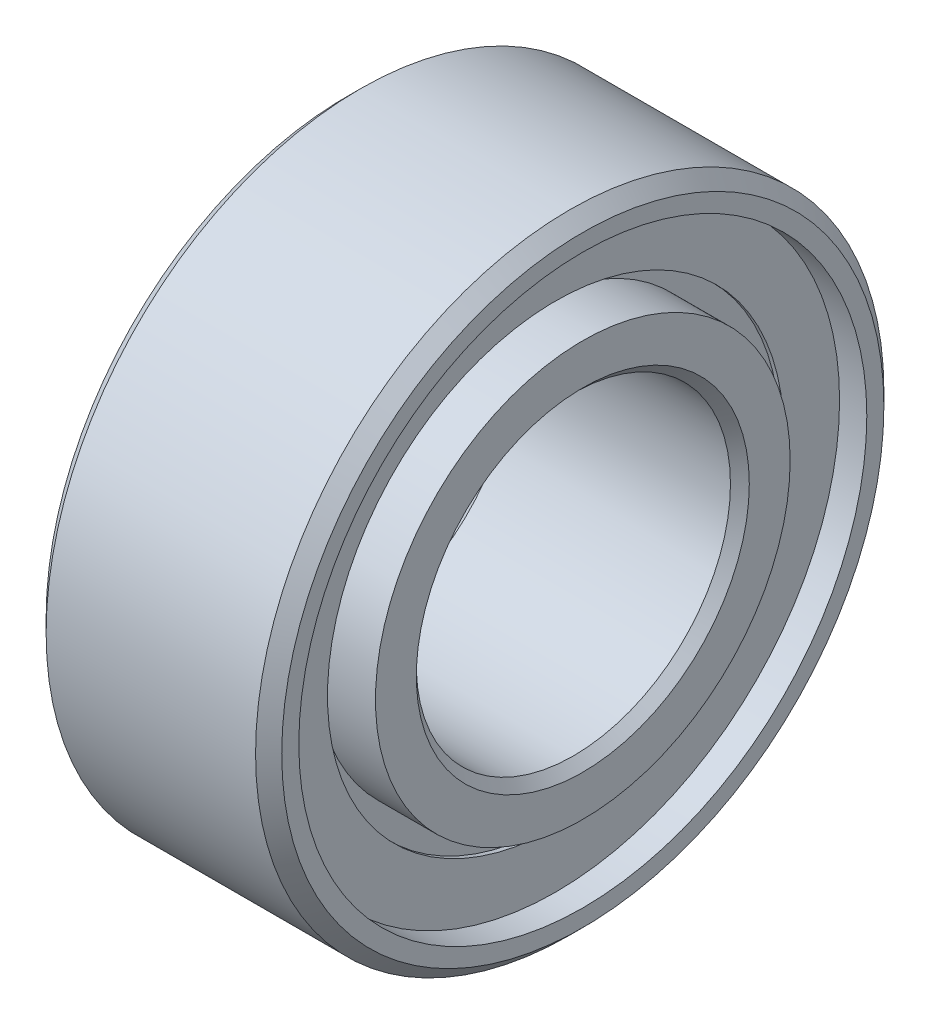
ISO-10303-21;
HEADER;
FILE_DESCRIPTION(('STEP AP214'),'2;1');
FILE_NAME('part.step','',(''),(''),'','','');
FILE_SCHEMA(('AUTOMOTIVE_DESIGN { 1 0 10303 214 1 1 1 1 }'));
ENDSEC;
DATA;
#1=APPLICATION_CONTEXT('core data for automotive mechanical design processes');
#2=APPLICATION_PROTOCOL_DEFINITION('international standard','automotive_design',2000,#1);
#3=PRODUCT_CONTEXT('',#1,'mechanical');
#4=PRODUCT('Part','Part','',(#3));
#5=PRODUCT_RELATED_PRODUCT_CATEGORY('part','',(#4));
#6=PRODUCT_DEFINITION_FORMATION('','',#4);
#7=PRODUCT_DEFINITION_CONTEXT('part definition',#1,'design');
#8=PRODUCT_DEFINITION('design','',#6,#7);
#9=PRODUCT_DEFINITION_SHAPE('','',#8);
#10=(LENGTH_UNIT() NAMED_UNIT(*) SI_UNIT(.MILLI.,.METRE.));
#11=(NAMED_UNIT(*) PLANE_ANGLE_UNIT() SI_UNIT($,.RADIAN.));
#12=(NAMED_UNIT(*) SI_UNIT($,.STERADIAN.) SOLID_ANGLE_UNIT());
#13=UNCERTAINTY_MEASURE_WITH_UNIT(LENGTH_MEASURE(1.E-05),#10,'distance_accuracy_value','');
#14=(GEOMETRIC_REPRESENTATION_CONTEXT(3) GLOBAL_UNCERTAINTY_ASSIGNED_CONTEXT((#13)) GLOBAL_UNIT_ASSIGNED_CONTEXT((#10,
#11,#12)) REPRESENTATION_CONTEXT('',''));
#15=CARTESIAN_POINT('',(0.,0.,0.));
#16=DIRECTION('',(0.,0.,1.));
#17=DIRECTION('',(1.,0.,0.));
#18=AXIS2_PLACEMENT_3D('',#15,#16,#17);
#19=CARTESIAN_POINT('',(-2.619375,0.,0.));
#20=DIRECTION('',(1.,0.,0.));
#21=DIRECTION('',(0.,0.,-1.));
#22=AXIS2_PLACEMENT_3D('',#19,#20,#21);
#23=CYLINDRICAL_SURFACE('',#22,3.175);
#24=CARTESIAN_POINT('',(2.19074999995428,0.,0.));
#25=DIRECTION('',(1.,0.,0.));
#26=DIRECTION('',(0.,-1.,0.));
#27=AXIS2_PLACEMENT_3D('',#24,#25,#26);
#28=CIRCLE('',#27,3.17499999999882);
#29=CARTESIAN_POINT('',(2.19074999995428,-3.17499999999882,0.));
#30=VERTEX_POINT('',#29);
#31=EDGE_CURVE('E32',#30,#30,#28,.T.);
#32=ORIENTED_EDGE('',*,*,#31,.T.);
#33=EDGE_LOOP('',(#32));
#34=FACE_BOUND('',#33,.T.);
#35=CARTESIAN_POINT('',(-2.19074999995428,0.,0.));
#36=DIRECTION('',(-1.,0.,0.));
#37=DIRECTION('',(0.,1.,0.));
#38=AXIS2_PLACEMENT_3D('',#35,#36,#37);
#39=CIRCLE('',#38,3.17499999999882);
#40=CARTESIAN_POINT('',(-2.19074999995428,3.17499999999882,0.));
#41=VERTEX_POINT('',#40);
#42=EDGE_CURVE('E29',#41,#41,#39,.T.);
#43=ORIENTED_EDGE('',*,*,#42,.T.);
#44=EDGE_LOOP('',(#43));
#45=FACE_BOUND('',#44,.T.);
#46=ADVANCED_FACE('F14',(#34,#45),#23,.F.);
#47=CARTESIAN_POINT('',(2.38124999992806,0.,0.));
#48=DIRECTION('',(1.,0.,0.));
#49=DIRECTION('',(0.,0.,-1.));
#50=AXIS2_PLACEMENT_3D('',#47,#48,#49);
#51=CONICAL_SURFACE('',#50,3.36550000002944,0.785398163546644);
#52=CARTESIAN_POINT('',(2.38124999992806,0.,0.));
#53=DIRECTION('',(1.,0.,0.));
#54=DIRECTION('',(0.,0.,-1.));
#55=AXIS2_PLACEMENT_3D('',#52,#53,#54);
#56=CIRCLE('',#55,3.36550000002944);
#57=CARTESIAN_POINT('',(2.38124999992806,0.,-3.36550000002944));
#58=VERTEX_POINT('',#57);
#59=EDGE_CURVE('E17',#58,#58,#56,.F.);
#60=ORIENTED_EDGE('',*,*,#59,.F.);
#61=EDGE_LOOP('',(#60));
#62=FACE_BOUND('',#61,.T.);
#63=ORIENTED_EDGE('',*,*,#31,.F.);
#64=EDGE_LOOP('',(#63));
#65=FACE_BOUND('',#64,.T.);
#66=ADVANCED_FACE('F97',(#62,#65),#51,.F.);
#67=CARTESIAN_POINT('',(-2.38124999992806,0.,0.));
#68=DIRECTION('',(-1.,0.,0.));
#69=DIRECTION('',(0.,0.,1.));
#70=AXIS2_PLACEMENT_3D('',#67,#68,#69);
#71=CONICAL_SURFACE('',#70,3.36550000002944,0.785398163546644);
#72=ORIENTED_EDGE('',*,*,#42,.F.);
#73=EDGE_LOOP('',(#72));
#74=FACE_BOUND('',#73,.T.);
#75=CARTESIAN_POINT('',(-2.38124999992806,0.,0.));
#76=DIRECTION('',(-1.,0.,0.));
#77=DIRECTION('',(0.,0.,1.));
#78=AXIS2_PLACEMENT_3D('',#75,#76,#77);
#79=CIRCLE('',#78,3.36550000002944);
#80=CARTESIAN_POINT('',(-2.38124999992806,0.,3.36550000002944));
#81=VERTEX_POINT('',#80);
#82=EDGE_CURVE('E87',#81,#81,#79,.T.);
#83=ORIENTED_EDGE('',*,*,#82,.T.);
#84=EDGE_LOOP('',(#83));
#85=FACE_BOUND('',#84,.T.);
#86=ADVANCED_FACE('F100',(#74,#85),#71,.F.);
#87=CARTESIAN_POINT('',(2.38125,0.,0.));
#88=DIRECTION('',(1.,0.,0.));
#89=DIRECTION('',(0.,0.,-1.));
#90=AXIS2_PLACEMENT_3D('',#87,#88,#89);
#91=PLANE('',#90);
#92=ORIENTED_EDGE('',*,*,#59,.T.);
#93=EDGE_LOOP('',(#92));
#94=FACE_BOUND('',#93,.T.);
#95=CARTESIAN_POINT('',(2.38125,0.,0.));
#96=DIRECTION('',(1.,0.,0.));
#97=DIRECTION('',(0.,0.,-1.));
#98=AXIS2_PLACEMENT_3D('',#95,#96,#97);
#99=CIRCLE('',#98,4.191);
#100=CARTESIAN_POINT('',(2.38125,0.,-4.191));
#101=VERTEX_POINT('',#100);
#102=EDGE_CURVE('E85',#101,#101,#99,.F.);
#103=ORIENTED_EDGE('',*,*,#102,.F.);
#104=EDGE_LOOP('',(#103));
#105=FACE_BOUND('',#104,.T.);
#106=ADVANCED_FACE('F94',(#94,#105),#91,.T.);
#107=CARTESIAN_POINT('',(-2.38125,0.,0.));
#108=DIRECTION('',(1.,0.,0.));
#109=DIRECTION('',(0.,0.,-1.));
#110=AXIS2_PLACEMENT_3D('',#107,#108,#109);
#111=PLANE('',#110);
#112=ORIENTED_EDGE('',*,*,#82,.F.);
#113=EDGE_LOOP('',(#112));
#114=FACE_BOUND('',#113,.T.);
#115=CARTESIAN_POINT('',(-2.38125,0.,0.));
#116=DIRECTION('',(1.,0.,0.));
#117=DIRECTION('',(0.,0.,-1.));
#118=AXIS2_PLACEMENT_3D('',#115,#116,#117);
#119=CIRCLE('',#118,4.191);
#120=CARTESIAN_POINT('',(-2.38125,0.,-4.191));
#121=VERTEX_POINT('',#120);
#122=EDGE_CURVE('E82',#121,#121,#119,.T.);
#123=ORIENTED_EDGE('',*,*,#122,.F.);
#124=EDGE_LOOP('',(#123));
#125=FACE_BOUND('',#124,.T.);
#126=ADVANCED_FACE('F113',(#114,#125),#111,.F.);
#127=CARTESIAN_POINT('',(-2.619375,0.,0.));
#128=DIRECTION('',(1.,0.,0.));
#129=DIRECTION('',(0.,0.,-1.));
#130=AXIS2_PLACEMENT_3D('',#127,#128,#129);
#131=CYLINDRICAL_SURFACE('',#130,4.191);
#132=CARTESIAN_POINT('',(1.190625,0.,0.));
#133=DIRECTION('',(1.,0.,0.));
#134=DIRECTION('',(0.,0.,-1.));
#135=AXIS2_PLACEMENT_3D('',#132,#133,#134);
#136=CIRCLE('',#135,4.191);
#137=CARTESIAN_POINT('',(1.190625,0.,-4.191));
#138=VERTEX_POINT('',#137);
#139=EDGE_CURVE('E79',#138,#138,#136,.F.);
#140=ORIENTED_EDGE('',*,*,#139,.F.);
#141=EDGE_LOOP('',(#140));
#142=FACE_BOUND('',#141,.T.);
#143=ORIENTED_EDGE('',*,*,#102,.T.);
#144=EDGE_LOOP('',(#143));
#145=FACE_BOUND('',#144,.T.);
#146=ADVANCED_FACE('F189',(#142,#145),#131,.T.);
#147=CARTESIAN_POINT('',(-2.619375,0.,0.));
#148=DIRECTION('',(1.,0.,0.));
#149=DIRECTION('',(0.,0.,-1.));
#150=AXIS2_PLACEMENT_3D('',#147,#148,#149);
#151=CYLINDRICAL_SURFACE('',#150,4.191);
#152=ORIENTED_EDGE('',*,*,#122,.T.);
#153=EDGE_LOOP('',(#152));
#154=FACE_BOUND('',#153,.T.);
#155=CARTESIAN_POINT('',(-1.190625,0.,0.));
#156=DIRECTION('',(1.,0.,0.));
#157=DIRECTION('',(0.,0.,-1.));
#158=AXIS2_PLACEMENT_3D('',#155,#156,#157);
#159=CIRCLE('',#158,4.191);
#160=CARTESIAN_POINT('',(-1.190625,0.,-4.191));
#161=VERTEX_POINT('',#160);
#162=EDGE_CURVE('E76',#161,#161,#159,.F.);
#163=ORIENTED_EDGE('',*,*,#162,.T.);
#164=EDGE_LOOP('',(#163));
#165=FACE_BOUND('',#164,.T.);
#166=ADVANCED_FACE('F185',(#154,#165),#151,.T.);
#167=CARTESIAN_POINT('',(1.190625,0.,0.));
#168=DIRECTION('',(1.,0.,0.));
#169=DIRECTION('',(0.,0.,-1.));
#170=AXIS2_PLACEMENT_3D('',#167,#168,#169);
#171=PLANE('',#170);
#172=ORIENTED_EDGE('',*,*,#139,.T.);
#173=EDGE_LOOP('',(#172));
#174=FACE_BOUND('',#173,.T.);
#175=CARTESIAN_POINT('',(1.190625,0.,0.));
#176=DIRECTION('',(1.,0.,0.));
#177=DIRECTION('',(0.,0.,-1.));
#178=AXIS2_PLACEMENT_3D('',#175,#176,#177);
#179=CIRCLE('',#178,5.7404);
#180=CARTESIAN_POINT('',(1.190625,0.,-5.7404));
#181=VERTEX_POINT('',#180);
#182=EDGE_CURVE('E73',#181,#181,#179,.T.);
#183=ORIENTED_EDGE('',*,*,#182,.T.);
#184=EDGE_LOOP('',(#183));
#185=FACE_BOUND('',#184,.T.);
#186=ADVANCED_FACE('F181',(#174,#185),#171,.T.);
#187=CARTESIAN_POINT('',(-1.190625,0.,0.));
#188=DIRECTION('',(1.,0.,0.));
#189=DIRECTION('',(0.,0.,-1.));
#190=AXIS2_PLACEMENT_3D('',#187,#188,#189);
#191=PLANE('',#190);
#192=ORIENTED_EDGE('',*,*,#162,.F.);
#193=EDGE_LOOP('',(#192));
#194=FACE_BOUND('',#193,.T.);
#195=CARTESIAN_POINT('',(-1.190625,0.,0.));
#196=DIRECTION('',(1.,0.,0.));
#197=DIRECTION('',(0.,0.,-1.));
#198=AXIS2_PLACEMENT_3D('',#195,#196,#197);
#199=CIRCLE('',#198,5.7404);
#200=CARTESIAN_POINT('',(-1.190625,0.,-5.7404));
#201=VERTEX_POINT('',#200);
#202=EDGE_CURVE('E70',#201,#201,#199,.F.);
#203=ORIENTED_EDGE('',*,*,#202,.T.);
#204=EDGE_LOOP('',(#203));
#205=FACE_BOUND('',#204,.T.);
#206=ADVANCED_FACE('F177',(#194,#205),#191,.F.);
#207=CARTESIAN_POINT('',(-2.619375,0.,0.));
#208=DIRECTION('',(1.,0.,0.));
#209=DIRECTION('',(0.,0.,-1.));
#210=AXIS2_PLACEMENT_3D('',#207,#208,#209);
#211=CYLINDRICAL_SURFACE('',#210,5.7404);
#212=ORIENTED_EDGE('',*,*,#182,.F.);
#213=EDGE_LOOP('',(#212));
#214=FACE_BOUND('',#213,.T.);
#215=CARTESIAN_POINT('',(1.7412890625,0.,0.));
#216=DIRECTION('',(1.,0.,0.));
#217=DIRECTION('',(0.,0.,-1.));
#218=AXIS2_PLACEMENT_3D('',#215,#216,#217);
#219=CIRCLE('',#218,5.7404);
#220=CARTESIAN_POINT('',(1.7412890625,0.,-5.7404));
#221=VERTEX_POINT('',#220);
#222=EDGE_CURVE('E67',#221,#221,#219,.T.);
#223=ORIENTED_EDGE('',*,*,#222,.T.);
#224=EDGE_LOOP('',(#223));
#225=FACE_BOUND('',#224,.T.);
#226=ADVANCED_FACE('F173',(#214,#225),#211,.F.);
#227=CARTESIAN_POINT('',(-2.619375,0.,0.));
#228=DIRECTION('',(1.,0.,0.));
#229=DIRECTION('',(0.,0.,-1.));
#230=AXIS2_PLACEMENT_3D('',#227,#228,#229);
#231=CYLINDRICAL_SURFACE('',#230,5.7404);
#232=ORIENTED_EDGE('',*,*,#202,.F.);
#233=EDGE_LOOP('',(#232));
#234=FACE_BOUND('',#233,.T.);
#235=CARTESIAN_POINT('',(-1.7412890625,0.,0.));
#236=DIRECTION('',(1.,0.,0.));
#237=DIRECTION('',(0.,0.,-1.));
#238=AXIS2_PLACEMENT_3D('',#235,#236,#237);
#239=CIRCLE('',#238,5.7404);
#240=CARTESIAN_POINT('',(-1.7412890625,0.,-5.7404));
#241=VERTEX_POINT('',#240);
#242=EDGE_CURVE('E64',#241,#241,#239,.T.);
#243=ORIENTED_EDGE('',*,*,#242,.F.);
#244=EDGE_LOOP('',(#243));
#245=FACE_BOUND('',#244,.T.);
#246=ADVANCED_FACE('F169',(#234,#245),#231,.F.);
#247=CARTESIAN_POINT('',(1.7412890625,0.,0.));
#248=DIRECTION('',(1.,0.,0.));
#249=DIRECTION('',(0.,0.,-1.));
#250=AXIS2_PLACEMENT_3D('',#247,#248,#249);
#251=PLANE('',#250);
#252=CARTESIAN_POINT('',(1.7412890625,0.,0.));
#253=DIRECTION('',(1.,0.,0.));
#254=DIRECTION('',(0.,0.,-1.));
#255=AXIS2_PLACEMENT_3D('',#252,#253,#254);
#256=CIRCLE('',#255,4.6101);
#257=CARTESIAN_POINT('',(1.7412890625,0.,-4.6101));
#258=VERTEX_POINT('',#257);
#259=EDGE_CURVE('E61',#258,#258,#256,.T.);
#260=ORIENTED_EDGE('',*,*,#259,.T.);
#261=EDGE_LOOP('',(#260));
#262=FACE_BOUND('',#261,.T.);
#263=ORIENTED_EDGE('',*,*,#222,.F.);
#264=EDGE_LOOP('',(#263));
#265=FACE_BOUND('',#264,.T.);
#266=ADVANCED_FACE('F165',(#262,#265),#251,.F.);
#267=CARTESIAN_POINT('',(-1.7412890625,0.,0.));
#268=DIRECTION('',(1.,0.,0.));
#269=DIRECTION('',(0.,0.,-1.));
#270=AXIS2_PLACEMENT_3D('',#267,#268,#269);
#271=PLANE('',#270);
#272=CARTESIAN_POINT('',(-1.7412890625,0.,0.));
#273=DIRECTION('',(1.,0.,0.));
#274=DIRECTION('',(0.,0.,-1.));
#275=AXIS2_PLACEMENT_3D('',#272,#273,#274);
#276=CIRCLE('',#275,4.6101);
#277=CARTESIAN_POINT('',(-1.7412890625,0.,-4.6101));
#278=VERTEX_POINT('',#277);
#279=EDGE_CURVE('E58',#278,#278,#276,.F.);
#280=ORIENTED_EDGE('',*,*,#279,.T.);
#281=EDGE_LOOP('',(#280));
#282=FACE_BOUND('',#281,.T.);
#283=ORIENTED_EDGE('',*,*,#242,.T.);
#284=EDGE_LOOP('',(#283));
#285=FACE_BOUND('',#284,.T.);
#286=ADVANCED_FACE('F161',(#282,#285),#271,.T.);
#287=CARTESIAN_POINT('',(1.73682421875,0.,0.));
#288=DIRECTION('',(1.,0.,0.));
#289=DIRECTION('',(0.,0.,-1.));
#290=AXIS2_PLACEMENT_3D('',#287,#288,#289);
#291=CYLINDRICAL_SURFACE('',#290,4.6101);
#292=CARTESIAN_POINT('',(1.8305859375,0.,0.));
#293=DIRECTION('',(1.,0.,0.));
#294=DIRECTION('',(0.,0.,-1.));
#295=AXIS2_PLACEMENT_3D('',#292,#293,#294);
#296=CIRCLE('',#295,4.6101);
#297=CARTESIAN_POINT('',(1.8305859375,0.,-4.6101));
#298=VERTEX_POINT('',#297);
#299=EDGE_CURVE('E55',#298,#298,#296,.F.);
#300=ORIENTED_EDGE('',*,*,#299,.F.);
#301=EDGE_LOOP('',(#300));
#302=FACE_BOUND('',#301,.T.);
#303=ORIENTED_EDGE('',*,*,#259,.F.);
#304=EDGE_LOOP('',(#303));
#305=FACE_BOUND('',#304,.T.);
#306=ADVANCED_FACE('F157',(#302,#305),#291,.F.);
#307=CARTESIAN_POINT('',(-1.73682421875,0.,0.));
#308=DIRECTION('',(1.,0.,0.));
#309=DIRECTION('',(0.,0.,-1.));
#310=AXIS2_PLACEMENT_3D('',#307,#308,#309);
#311=CYLINDRICAL_SURFACE('',#310,4.6101);
#312=CARTESIAN_POINT('',(-1.8305859375,0.,0.));
#313=DIRECTION('',(1.,0.,0.));
#314=DIRECTION('',(0.,0.,-1.));
#315=AXIS2_PLACEMENT_3D('',#312,#313,#314);
#316=CIRCLE('',#315,4.6101);
#317=CARTESIAN_POINT('',(-1.8305859375,0.,-4.6101));
#318=VERTEX_POINT('',#317);
#319=EDGE_CURVE('E52',#318,#318,#316,.F.);
#320=ORIENTED_EDGE('',*,*,#319,.T.);
#321=EDGE_LOOP('',(#320));
#322=FACE_BOUND('',#321,.T.);
#323=ORIENTED_EDGE('',*,*,#279,.F.);
#324=EDGE_LOOP('',(#323));
#325=FACE_BOUND('',#324,.T.);
#326=ADVANCED_FACE('F153',(#322,#325),#311,.F.);
#327=CARTESIAN_POINT('',(1.8305859375,0.,0.));
#328=DIRECTION('',(1.,0.,0.));
#329=DIRECTION('',(0.,0.,-1.));
#330=AXIS2_PLACEMENT_3D('',#327,#328,#329);
#331=PLANE('',#330);
#332=ORIENTED_EDGE('',*,*,#299,.T.);
#333=EDGE_LOOP('',(#332));
#334=FACE_BOUND('',#333,.T.);
#335=CARTESIAN_POINT('',(1.8305859375,0.,0.));
#336=DIRECTION('',(1.,0.,0.));
#337=DIRECTION('',(0.,0.,-1.));
#338=AXIS2_PLACEMENT_3D('',#335,#336,#337);
#339=CIRCLE('',#338,5.7404);
#340=CARTESIAN_POINT('',(1.8305859375,0.,-5.7404));
#341=VERTEX_POINT('',#340);
#342=EDGE_CURVE('E49',#341,#341,#339,.T.);
#343=ORIENTED_EDGE('',*,*,#342,.T.);
#344=EDGE_LOOP('',(#343));
#345=FACE_BOUND('',#344,.T.);
#346=ADVANCED_FACE('F149',(#334,#345),#331,.T.);
#347=CARTESIAN_POINT('',(-1.8305859375,0.,0.));
#348=DIRECTION('',(1.,0.,0.));
#349=DIRECTION('',(0.,0.,-1.));
#350=AXIS2_PLACEMENT_3D('',#347,#348,#349);
#351=PLANE('',#350);
#352=ORIENTED_EDGE('',*,*,#319,.F.);
#353=EDGE_LOOP('',(#352));
#354=FACE_BOUND('',#353,.T.);
#355=CARTESIAN_POINT('',(-1.8305859375,0.,0.));
#356=DIRECTION('',(1.,0.,0.));
#357=DIRECTION('',(0.,0.,-1.));
#358=AXIS2_PLACEMENT_3D('',#355,#356,#357);
#359=CIRCLE('',#358,5.7404);
#360=CARTESIAN_POINT('',(-1.8305859375,0.,-5.7404));
#361=VERTEX_POINT('',#360);
#362=EDGE_CURVE('E46',#361,#361,#359,.F.);
#363=ORIENTED_EDGE('',*,*,#362,.T.);
#364=EDGE_LOOP('',(#363));
#365=FACE_BOUND('',#364,.T.);
#366=ADVANCED_FACE('F145',(#354,#365),#351,.F.);
#367=CARTESIAN_POINT('',(-2.619375,0.,0.));
#368=DIRECTION('',(1.,0.,0.));
#369=DIRECTION('',(0.,0.,-1.));
#370=AXIS2_PLACEMENT_3D('',#367,#368,#369);
#371=CYLINDRICAL_SURFACE('',#370,5.7404);
#372=CARTESIAN_POINT('',(2.38125,0.,0.));
#373=DIRECTION('',(1.,0.,0.));
#374=DIRECTION('',(0.,0.,-1.));
#375=AXIS2_PLACEMENT_3D('',#372,#373,#374);
#376=CIRCLE('',#375,5.7404);
#377=CARTESIAN_POINT('',(2.38125,0.,-5.7404));
#378=VERTEX_POINT('',#377);
#379=EDGE_CURVE('E43',#378,#378,#376,.F.);
#380=ORIENTED_EDGE('',*,*,#379,.F.);
#381=EDGE_LOOP('',(#380));
#382=FACE_BOUND('',#381,.T.);
#383=ORIENTED_EDGE('',*,*,#342,.F.);
#384=EDGE_LOOP('',(#383));
#385=FACE_BOUND('',#384,.T.);
#386=ADVANCED_FACE('F141',(#382,#385),#371,.F.);
#387=CARTESIAN_POINT('',(-2.619375,0.,0.));
#388=DIRECTION('',(1.,0.,0.));
#389=DIRECTION('',(0.,0.,-1.));
#390=AXIS2_PLACEMENT_3D('',#387,#388,#389);
#391=CYLINDRICAL_SURFACE('',#390,5.7404);
#392=CARTESIAN_POINT('',(-2.38125,0.,0.));
#393=DIRECTION('',(1.,0.,0.));
#394=DIRECTION('',(0.,0.,-1.));
#395=AXIS2_PLACEMENT_3D('',#392,#393,#394);
#396=CIRCLE('',#395,5.7404);
#397=CARTESIAN_POINT('',(-2.38125,0.,-5.7404));
#398=VERTEX_POINT('',#397);
#399=EDGE_CURVE('E40',#398,#398,#396,.F.);
#400=ORIENTED_EDGE('',*,*,#399,.T.);
#401=EDGE_LOOP('',(#400));
#402=FACE_BOUND('',#401,.T.);
#403=ORIENTED_EDGE('',*,*,#362,.F.);
#404=EDGE_LOOP('',(#403));
#405=FACE_BOUND('',#404,.T.);
#406=ADVANCED_FACE('F137',(#402,#405),#391,.F.);
#407=CARTESIAN_POINT('',(2.38125,0.,0.));
#408=DIRECTION('',(1.,0.,0.));
#409=DIRECTION('',(0.,0.,-1.));
#410=AXIS2_PLACEMENT_3D('',#407,#408,#409);
#411=PLANE('',#410);
#412=ORIENTED_EDGE('',*,*,#379,.T.);
#413=EDGE_LOOP('',(#412));
#414=FACE_BOUND('',#413,.T.);
#415=CARTESIAN_POINT('',(2.3812499999849,0.,0.));
#416=DIRECTION('',(-1.,0.,0.));
#417=DIRECTION('',(0.,0.,1.));
#418=AXIS2_PLACEMENT_3D('',#415,#416,#417);
#419=CIRCLE('',#418,6.08541666667861);
#420=CARTESIAN_POINT('',(2.3812499999849,0.,6.08541666667861));
#421=VERTEX_POINT('',#420);
#422=EDGE_CURVE('E37',#421,#421,#419,.T.);
#423=ORIENTED_EDGE('',*,*,#422,.F.);
#424=EDGE_LOOP('',(#423));
#425=FACE_BOUND('',#424,.T.);
#426=ADVANCED_FACE('F133',(#414,#425),#411,.T.);
#427=CARTESIAN_POINT('',(-2.38125,0.,0.));
#428=DIRECTION('',(1.,0.,0.));
#429=DIRECTION('',(0.,0.,-1.));
#430=AXIS2_PLACEMENT_3D('',#427,#428,#429);
#431=PLANE('',#430);
#432=ORIENTED_EDGE('',*,*,#399,.F.);
#433=EDGE_LOOP('',(#432));
#434=FACE_BOUND('',#433,.T.);
#435=CARTESIAN_POINT('',(-2.3812499999849,0.,0.));
#436=DIRECTION('',(1.,0.,0.));
#437=DIRECTION('',(0.,0.,-1.));
#438=AXIS2_PLACEMENT_3D('',#435,#436,#437);
#439=CIRCLE('',#438,6.08541666667861);
#440=CARTESIAN_POINT('',(-2.3812499999849,0.,-6.08541666667861));
#441=VERTEX_POINT('',#440);
#442=EDGE_CURVE('E26',#441,#441,#439,.T.);
#443=ORIENTED_EDGE('',*,*,#442,.F.);
#444=EDGE_LOOP('',(#443));
#445=FACE_BOUND('',#444,.T.);
#446=ADVANCED_FACE('F129',(#434,#445),#431,.F.);
#447=CARTESIAN_POINT('',(2.11666666666588,0.,0.));
#448=DIRECTION('',(-1.,0.,0.));
#449=DIRECTION('',(0.,0.,1.));
#450=AXIS2_PLACEMENT_3D('',#447,#448,#449);
#451=CONICAL_SURFACE('',#450,6.34999999999764,0.785398163397448);
#452=CARTESIAN_POINT('',(2.11666666666658,0.,0.));
#453=DIRECTION('',(1.,0.,0.));
#454=DIRECTION('',(0.,0.,-1.));
#455=AXIS2_PLACEMENT_3D('',#452,#453,#454);
#456=CIRCLE('',#455,6.35);
#457=CARTESIAN_POINT('',(2.11666666666658,0.,-6.35));
#458=VERTEX_POINT('',#457);
#459=EDGE_CURVE('E21',#458,#458,#456,.F.);
#460=ORIENTED_EDGE('',*,*,#459,.F.);
#461=EDGE_LOOP('',(#460));
#462=FACE_BOUND('',#461,.T.);
#463=ORIENTED_EDGE('',*,*,#422,.T.);
#464=EDGE_LOOP('',(#463));
#465=FACE_BOUND('',#464,.T.);
#466=ADVANCED_FACE('F122',(#462,#465),#451,.T.);
#467=CARTESIAN_POINT('',(-2.11666666666588,0.,0.));
#468=DIRECTION('',(1.,0.,0.));
#469=DIRECTION('',(0.,0.,-1.));
#470=AXIS2_PLACEMENT_3D('',#467,#468,#469);
#471=CONICAL_SURFACE('',#470,6.34999999999764,0.785398163397448);
#472=ORIENTED_EDGE('',*,*,#442,.T.);
#473=EDGE_LOOP('',(#472));
#474=FACE_BOUND('',#473,.T.);
#475=CARTESIAN_POINT('',(-2.11666666666658,0.,0.));
#476=DIRECTION('',(1.,0.,0.));
#477=DIRECTION('',(0.,0.,-1.));
#478=AXIS2_PLACEMENT_3D('',#475,#476,#477);
#479=CIRCLE('',#478,6.35);
#480=CARTESIAN_POINT('',(-2.11666666666658,0.,-6.35));
#481=VERTEX_POINT('',#480);
#482=EDGE_CURVE('E9',#481,#481,#479,.T.);
#483=ORIENTED_EDGE('',*,*,#482,.F.);
#484=EDGE_LOOP('',(#483));
#485=FACE_BOUND('',#484,.T.);
#486=ADVANCED_FACE('F117',(#474,#485),#471,.T.);
#487=CARTESIAN_POINT('',(-2.619375,0.,0.));
#488=DIRECTION('',(1.,0.,0.));
#489=DIRECTION('',(0.,0.,-1.));
#490=AXIS2_PLACEMENT_3D('',#487,#488,#489);
#491=CYLINDRICAL_SURFACE('',#490,6.35);
#492=ORIENTED_EDGE('',*,*,#482,.T.);
#493=EDGE_LOOP('',(#492));
#494=FACE_BOUND('',#493,.T.);
#495=ORIENTED_EDGE('',*,*,#459,.T.);
#496=EDGE_LOOP('',(#495));
#497=FACE_BOUND('',#496,.T.);
#498=ADVANCED_FACE('F115',(#494,#497),#491,.T.);
#499=CLOSED_SHELL('',(#46,#66,#86,#106,#126,#146,#166,#186,#206,#226,#246,#266,#286,#306,#326,
#346,#366,#386,#406,#426,#446,#466,#486,#498));
#500=MANIFOLD_SOLID_BREP('B1',#499);
#501=ADVANCED_BREP_SHAPE_REPRESENTATION('',(#18,#500),#14);
#502=SHAPE_DEFINITION_REPRESENTATION(#9,#501);
ENDSEC;
END-ISO-10303-21;
